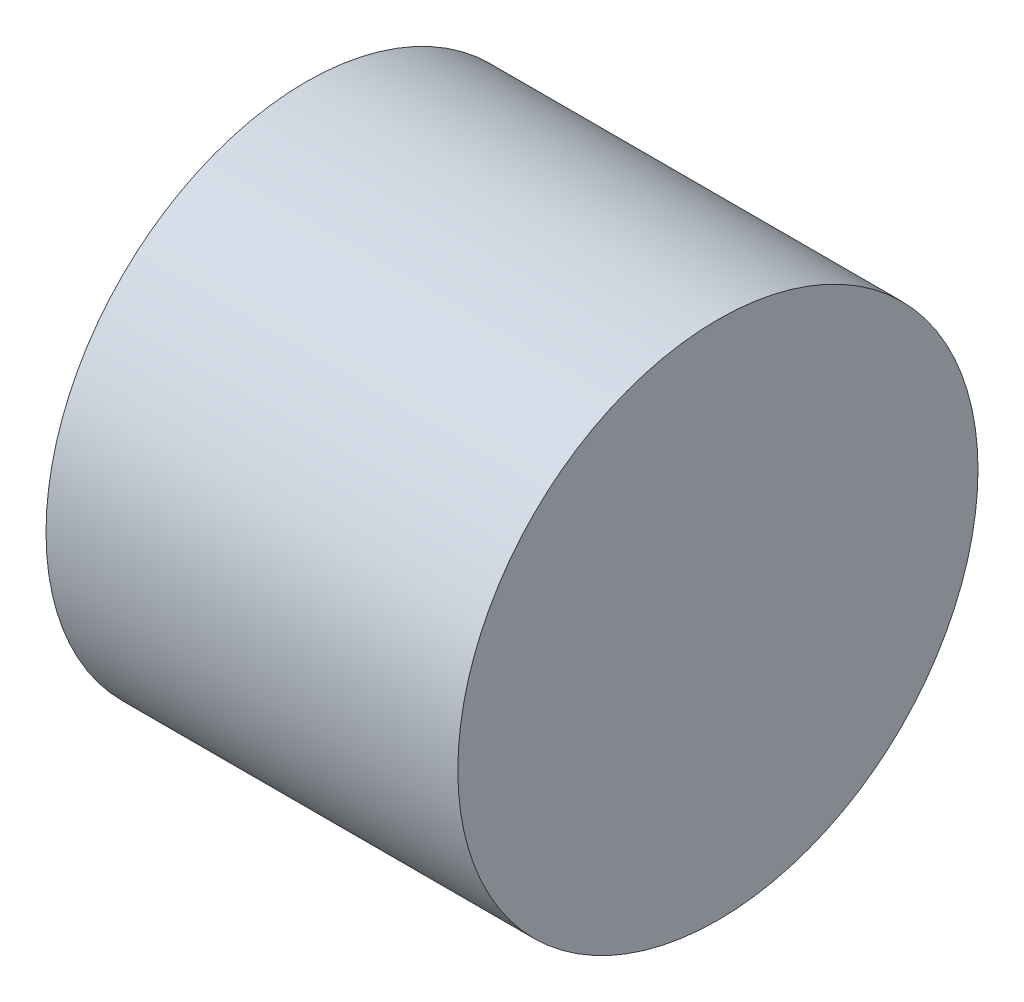
ISO-10303-21;
HEADER;
FILE_DESCRIPTION(('STEP AP214'),'2;1');
FILE_NAME('part.step','',(''),(''),'','','');
FILE_SCHEMA(('AUTOMOTIVE_DESIGN { 1 0 10303 214 1 1 1 1 }'));
ENDSEC;
DATA;
#1=APPLICATION_CONTEXT('core data for automotive mechanical design processes');
#2=APPLICATION_PROTOCOL_DEFINITION('international standard','automotive_design',2000,#1);
#3=PRODUCT_CONTEXT('',#1,'mechanical');
#4=PRODUCT('Part','Part','',(#3));
#5=PRODUCT_RELATED_PRODUCT_CATEGORY('part','',(#4));
#6=PRODUCT_DEFINITION_FORMATION('','',#4);
#7=PRODUCT_DEFINITION_CONTEXT('part definition',#1,'design');
#8=PRODUCT_DEFINITION('design','',#6,#7);
#9=PRODUCT_DEFINITION_SHAPE('','',#8);
#10=(LENGTH_UNIT() NAMED_UNIT(*) SI_UNIT(.MILLI.,.METRE.));
#11=(NAMED_UNIT(*) PLANE_ANGLE_UNIT() SI_UNIT($,.RADIAN.));
#12=(NAMED_UNIT(*) SI_UNIT($,.STERADIAN.) SOLID_ANGLE_UNIT());
#13=UNCERTAINTY_MEASURE_WITH_UNIT(LENGTH_MEASURE(1.E-05),#10,'distance_accuracy_value','');
#14=(GEOMETRIC_REPRESENTATION_CONTEXT(3) GLOBAL_UNCERTAINTY_ASSIGNED_CONTEXT((#13)) GLOBAL_UNIT_ASSIGNED_CONTEXT((#10,
#11,#12)) REPRESENTATION_CONTEXT('',''));
#15=CARTESIAN_POINT('',(0.,0.,0.));
#16=DIRECTION('',(0.,0.,1.));
#17=DIRECTION('',(1.,0.,0.));
#18=AXIS2_PLACEMENT_3D('',#15,#16,#17);
#19=CARTESIAN_POINT('',(37.9,-18.,-22.5));
#20=DIRECTION('',(1.,0.,0.));
#21=DIRECTION('',(0.,0.,-1.));
#22=AXIS2_PLACEMENT_3D('',#19,#20,#21);
#23=CYLINDRICAL_SURFACE('',#22,6.);
#24=CARTESIAN_POINT('',(37.9,-18.,-22.5));
#25=DIRECTION('',(1.,0.,0.));
#26=DIRECTION('',(0.,0.,-1.));
#27=AXIS2_PLACEMENT_3D('',#24,#25,#26);
#28=CIRCLE('',#27,6.);
#29=CARTESIAN_POINT('',(37.9,-18.,-28.5));
#30=VERTEX_POINT('',#29);
#31=EDGE_CURVE('E10',#30,#30,#28,.T.);
#32=ORIENTED_EDGE('',*,*,#31,.T.);
#33=EDGE_LOOP('',(#32));
#34=FACE_BOUND('',#33,.T.);
#35=CARTESIAN_POINT('',(47.4,-18.,-22.5));
#36=DIRECTION('',(1.,0.,0.));
#37=DIRECTION('',(0.,0.,-1.));
#38=AXIS2_PLACEMENT_3D('',#35,#36,#37);
#39=CIRCLE('',#38,6.);
#40=CARTESIAN_POINT('',(47.4,-18.,-28.5));
#41=VERTEX_POINT('',#40);
#42=EDGE_CURVE('E37',#41,#41,#39,.T.);
#43=ORIENTED_EDGE('',*,*,#42,.F.);
#44=EDGE_LOOP('',(#43));
#45=FACE_BOUND('',#44,.T.);
#46=ADVANCED_FACE('F40',(#34,#45),#23,.T.);
#47=CARTESIAN_POINT('',(37.9,-18.,-22.5));
#48=DIRECTION('',(1.,0.,0.));
#49=DIRECTION('',(0.,0.,-1.));
#50=AXIS2_PLACEMENT_3D('',#47,#48,#49);
#51=PLANE('',#50);
#52=ORIENTED_EDGE('',*,*,#31,.F.);
#53=EDGE_LOOP('',(#52));
#54=FACE_BOUND('',#53,.T.);
#55=ADVANCED_FACE('F55',(#54),#51,.F.);
#56=CARTESIAN_POINT('',(47.4,-18.,-22.5));
#57=DIRECTION('',(1.,0.,0.));
#58=DIRECTION('',(0.,0.,-1.));
#59=AXIS2_PLACEMENT_3D('',#56,#57,#58);
#60=PLANE('',#59);
#61=ORIENTED_EDGE('',*,*,#42,.T.);
#62=EDGE_LOOP('',(#61));
#63=FACE_BOUND('',#62,.T.);
#64=ADVANCED_FACE('F47',(#63),#60,.T.);
#65=CLOSED_SHELL('',(#46,#55,#64));
#66=MANIFOLD_SOLID_BREP('B2',#65);
#67=ADVANCED_BREP_SHAPE_REPRESENTATION('',(#18,#66),#14);
#68=SHAPE_DEFINITION_REPRESENTATION(#9,#67);
ENDSEC;
END-ISO-10303-21;
